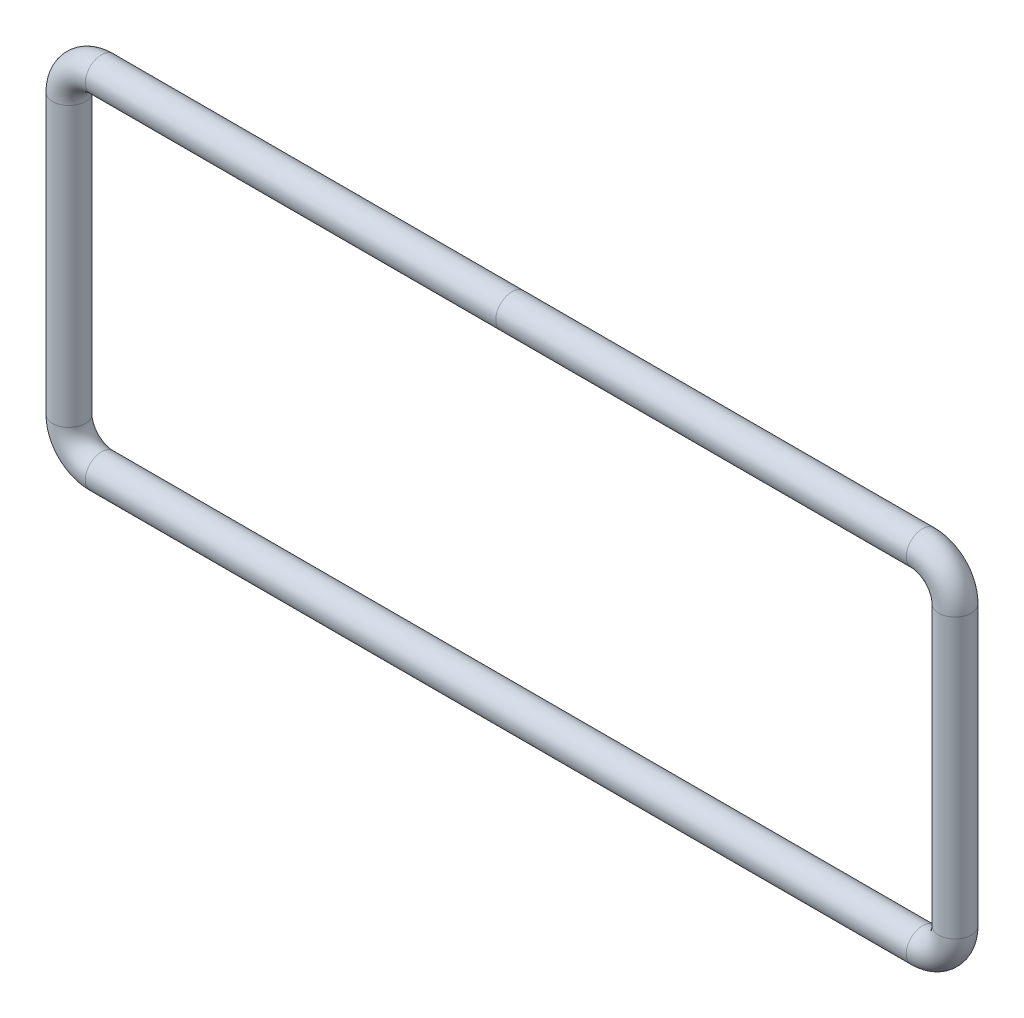
ISO-10303-21;
HEADER;
FILE_DESCRIPTION(('STEP AP214'),'2;1');
FILE_NAME('part.step','',(''),(''),'','','');
FILE_SCHEMA(('AUTOMOTIVE_DESIGN { 1 0 10303 214 1 1 1 1 }'));
ENDSEC;
DATA;
#1=APPLICATION_CONTEXT('core data for automotive mechanical design processes');
#2=APPLICATION_PROTOCOL_DEFINITION('international standard','automotive_design',2000,#1);
#3=PRODUCT_CONTEXT('',#1,'mechanical');
#4=PRODUCT('Part','Part','',(#3));
#5=PRODUCT_RELATED_PRODUCT_CATEGORY('part','',(#4));
#6=PRODUCT_DEFINITION_FORMATION('','',#4);
#7=PRODUCT_DEFINITION_CONTEXT('part definition',#1,'design');
#8=PRODUCT_DEFINITION('design','',#6,#7);
#9=PRODUCT_DEFINITION_SHAPE('','',#8);
#10=(LENGTH_UNIT() NAMED_UNIT(*) SI_UNIT(.MILLI.,.METRE.));
#11=(NAMED_UNIT(*) PLANE_ANGLE_UNIT() SI_UNIT($,.RADIAN.));
#12=(NAMED_UNIT(*) SI_UNIT($,.STERADIAN.) SOLID_ANGLE_UNIT());
#13=UNCERTAINTY_MEASURE_WITH_UNIT(LENGTH_MEASURE(1.E-05),#10,'distance_accuracy_value','');
#14=(GEOMETRIC_REPRESENTATION_CONTEXT(3) GLOBAL_UNCERTAINTY_ASSIGNED_CONTEXT((#13)) GLOBAL_UNIT_ASSIGNED_CONTEXT((#10,
#11,#12)) REPRESENTATION_CONTEXT('',''));
#15=CARTESIAN_POINT('',(0.,0.,0.));
#16=DIRECTION('',(0.,0.,1.));
#17=DIRECTION('',(1.,0.,0.));
#18=AXIS2_PLACEMENT_3D('',#15,#16,#17);
#19=CARTESIAN_POINT('',(-53.,22.2,0.));
#20=DIRECTION('',(1.,0.,0.));
#21=DIRECTION('',(0.,0.,-1.));
#22=AXIS2_PLACEMENT_3D('',#19,#20,#21);
#23=CYLINDRICAL_SURFACE('',#22,2.1);
#24=CARTESIAN_POINT('',(0.,22.2,0.));
#25=DIRECTION('',(1.,0.,0.));
#26=DIRECTION('',(0.,0.,-1.));
#27=AXIS2_PLACEMENT_3D('',#24,#25,#26);
#28=CIRCLE('',#27,2.1);
#29=CARTESIAN_POINT('',(0.,22.2,-2.1));
#30=VERTEX_POINT('',#29);
#31=EDGE_CURVE('E62',#30,#30,#28,.T.);
#32=ORIENTED_EDGE('',*,*,#31,.F.);
#33=EDGE_LOOP('',(#32));
#34=FACE_BOUND('',#33,.T.);
#35=CARTESIAN_POINT('',(-53.,22.2,0.));
#36=DIRECTION('',(1.,0.,0.));
#37=DIRECTION('',(0.,0.,-1.));
#38=AXIS2_PLACEMENT_3D('',#35,#36,#37);
#39=CIRCLE('',#38,2.1);
#40=CARTESIAN_POINT('',(-53.,24.3,0.));
#41=VERTEX_POINT('',#40);
#42=EDGE_CURVE('E10',#41,#41,#39,.T.);
#43=ORIENTED_EDGE('',*,*,#42,.T.);
#44=EDGE_LOOP('',(#43));
#45=FACE_BOUND('',#44,.T.);
#46=ADVANCED_FACE('F31',(#34,#45),#23,.T.);
#47=CARTESIAN_POINT('',(-53.,18.,0.));
#48=DIRECTION('',(0.,0.,-1.));
#49=DIRECTION('',(-1.,0.,0.));
#50=AXIS2_PLACEMENT_3D('',#47,#48,#49);
#51=TOROIDAL_SURFACE('',#50,4.2,2.1);
#52=CARTESIAN_POINT('',(-57.2,18.,0.));
#53=DIRECTION('',(0.,1.,0.));
#54=DIRECTION('',(0.,0.,-1.));
#55=AXIS2_PLACEMENT_3D('',#52,#53,#54);
#56=CIRCLE('',#55,2.1);
#57=CARTESIAN_POINT('',(-59.3,18.,0.));
#58=VERTEX_POINT('',#57);
#59=EDGE_CURVE('E37',#58,#58,#56,.T.);
#60=CARTESIAN_POINT('',(-53.,18.,0.));
#61=DIRECTION('',(0.,0.,-1.));
#62=DIRECTION('',(-1.,0.,0.));
#63=AXIS2_PLACEMENT_3D('',#60,#61,#62);
#64=CIRCLE('',#63,6.3);
#65=EDGE_CURVE('',#58,#41,#64,.T.);
#66=ORIENTED_EDGE('',*,*,#59,.T.);
#67=ORIENTED_EDGE('',*,*,#42,.F.);
#68=ORIENTED_EDGE('',*,*,#65,.T.);
#69=ORIENTED_EDGE('',*,*,#65,.F.);
#70=EDGE_LOOP('',(#66,#68,#67,#69));
#71=FACE_BOUND('',#70,.T.);
#72=ADVANCED_FACE('F69',(#71),#51,.T.);
#73=CARTESIAN_POINT('',(-57.2,-18.,0.));
#74=DIRECTION('',(0.,1.,0.));
#75=DIRECTION('',(-1.,0.,0.));
#76=AXIS2_PLACEMENT_3D('',#73,#74,#75);
#77=CYLINDRICAL_SURFACE('',#76,2.1);
#78=ORIENTED_EDGE('',*,*,#59,.F.);
#79=EDGE_LOOP('',(#78));
#80=FACE_BOUND('',#79,.T.);
#81=CARTESIAN_POINT('',(-57.2,-18.,0.));
#82=DIRECTION('',(0.,1.,0.));
#83=DIRECTION('',(0.,0.,-1.));
#84=AXIS2_PLACEMENT_3D('',#81,#82,#83);
#85=CIRCLE('',#84,2.1);
#86=CARTESIAN_POINT('',(-59.3,-18.,0.));
#87=VERTEX_POINT('',#86);
#88=EDGE_CURVE('E41',#87,#87,#85,.T.);
#89=ORIENTED_EDGE('',*,*,#88,.T.);
#90=EDGE_LOOP('',(#89));
#91=FACE_BOUND('',#90,.T.);
#92=ADVANCED_FACE('F73',(#80,#91),#77,.T.);
#93=CARTESIAN_POINT('',(-53.,-18.,0.));
#94=DIRECTION('',(0.,0.,-1.));
#95=DIRECTION('',(-1.,0.,0.));
#96=AXIS2_PLACEMENT_3D('',#93,#94,#95);
#97=TOROIDAL_SURFACE('',#96,4.2,2.1);
#98=CARTESIAN_POINT('',(-53.,-22.2,0.));
#99=DIRECTION('',(-1.,0.,0.));
#100=DIRECTION('',(0.,0.,-1.));
#101=AXIS2_PLACEMENT_3D('',#98,#99,#100);
#102=CIRCLE('',#101,2.1);
#103=CARTESIAN_POINT('',(-53.,-24.3,0.));
#104=VERTEX_POINT('',#103);
#105=EDGE_CURVE('E45',#104,#104,#102,.T.);
#106=CARTESIAN_POINT('',(-53.,-18.,0.));
#107=DIRECTION('',(0.,0.,-1.));
#108=DIRECTION('',(-1.,0.,0.));
#109=AXIS2_PLACEMENT_3D('',#106,#107,#108);
#110=CIRCLE('',#109,6.3);
#111=EDGE_CURVE('',#104,#87,#110,.T.);
#112=ORIENTED_EDGE('',*,*,#105,.T.);
#113=ORIENTED_EDGE('',*,*,#88,.F.);
#114=ORIENTED_EDGE('',*,*,#111,.T.);
#115=ORIENTED_EDGE('',*,*,#111,.F.);
#116=EDGE_LOOP('',(#112,#114,#113,#115));
#117=FACE_BOUND('',#116,.T.);
#118=ADVANCED_FACE('F78',(#117),#97,.T.);
#119=CARTESIAN_POINT('',(53.,-22.2,0.));
#120=DIRECTION('',(-1.,0.,0.));
#121=DIRECTION('',(0.,0.,1.));
#122=AXIS2_PLACEMENT_3D('',#119,#120,#121);
#123=CYLINDRICAL_SURFACE('',#122,2.1);
#124=ORIENTED_EDGE('',*,*,#105,.F.);
#125=EDGE_LOOP('',(#124));
#126=FACE_BOUND('',#125,.T.);
#127=CARTESIAN_POINT('',(53.,-22.2,0.));
#128=DIRECTION('',(-1.,0.,0.));
#129=DIRECTION('',(0.,0.,-1.));
#130=AXIS2_PLACEMENT_3D('',#127,#128,#129);
#131=CIRCLE('',#130,2.1);
#132=CARTESIAN_POINT('',(53.,-24.3,0.));
#133=VERTEX_POINT('',#132);
#134=EDGE_CURVE('E50',#133,#133,#131,.T.);
#135=ORIENTED_EDGE('',*,*,#134,.T.);
#136=EDGE_LOOP('',(#135));
#137=FACE_BOUND('',#136,.T.);
#138=ADVANCED_FACE('F84',(#126,#137),#123,.T.);
#139=CARTESIAN_POINT('',(53.,-18.,0.));
#140=DIRECTION('',(0.,0.,-1.));
#141=DIRECTION('',(-1.,0.,0.));
#142=AXIS2_PLACEMENT_3D('',#139,#140,#141);
#143=TOROIDAL_SURFACE('',#142,4.2,2.1);
#144=CARTESIAN_POINT('',(57.2,-18.,0.));
#145=DIRECTION('',(0.,-1.,0.));
#146=DIRECTION('',(0.,0.,-1.));
#147=AXIS2_PLACEMENT_3D('',#144,#145,#146);
#148=CIRCLE('',#147,2.1);
#149=CARTESIAN_POINT('',(59.3,-18.,0.));
#150=VERTEX_POINT('',#149);
#151=EDGE_CURVE('E53',#150,#150,#148,.T.);
#152=CARTESIAN_POINT('',(53.,-18.,0.));
#153=DIRECTION('',(0.,0.,-1.));
#154=DIRECTION('',(-1.,0.,0.));
#155=AXIS2_PLACEMENT_3D('',#152,#153,#154);
#156=CIRCLE('',#155,6.3);
#157=EDGE_CURVE('',#150,#133,#156,.T.);
#158=ORIENTED_EDGE('',*,*,#151,.T.);
#159=ORIENTED_EDGE('',*,*,#134,.F.);
#160=ORIENTED_EDGE('',*,*,#157,.T.);
#161=ORIENTED_EDGE('',*,*,#157,.F.);
#162=EDGE_LOOP('',(#158,#160,#159,#161));
#163=FACE_BOUND('',#162,.T.);
#164=ADVANCED_FACE('F88',(#163),#143,.T.);
#165=CARTESIAN_POINT('',(57.2,18.,0.));
#166=DIRECTION('',(0.,-1.,0.));
#167=DIRECTION('',(0.,0.,-1.));
#168=AXIS2_PLACEMENT_3D('',#165,#166,#167);
#169=CYLINDRICAL_SURFACE('',#168,2.1);
#170=ORIENTED_EDGE('',*,*,#151,.F.);
#171=EDGE_LOOP('',(#170));
#172=FACE_BOUND('',#171,.T.);
#173=CARTESIAN_POINT('',(57.2,18.,0.));
#174=DIRECTION('',(0.,-1.,0.));
#175=DIRECTION('',(0.,0.,-1.));
#176=AXIS2_PLACEMENT_3D('',#173,#174,#175);
#177=CIRCLE('',#176,2.1);
#178=CARTESIAN_POINT('',(59.3,18.,0.));
#179=VERTEX_POINT('',#178);
#180=EDGE_CURVE('E56',#179,#179,#177,.T.);
#181=ORIENTED_EDGE('',*,*,#180,.T.);
#182=EDGE_LOOP('',(#181));
#183=FACE_BOUND('',#182,.T.);
#184=ADVANCED_FACE('F92',(#172,#183),#169,.T.);
#185=CARTESIAN_POINT('',(53.,18.,0.));
#186=DIRECTION('',(0.,0.,-1.));
#187=DIRECTION('',(-1.,0.,0.));
#188=AXIS2_PLACEMENT_3D('',#185,#186,#187);
#189=TOROIDAL_SURFACE('',#188,4.2,2.1);
#190=CARTESIAN_POINT('',(53.,22.2,0.));
#191=DIRECTION('',(1.,0.,0.));
#192=DIRECTION('',(0.,0.,-1.));
#193=AXIS2_PLACEMENT_3D('',#190,#191,#192);
#194=CIRCLE('',#193,2.1);
#195=CARTESIAN_POINT('',(53.,24.3,0.));
#196=VERTEX_POINT('',#195);
#197=EDGE_CURVE('E59',#196,#196,#194,.T.);
#198=CARTESIAN_POINT('',(53.,18.,0.));
#199=DIRECTION('',(0.,0.,-1.));
#200=DIRECTION('',(-1.,0.,0.));
#201=AXIS2_PLACEMENT_3D('',#198,#199,#200);
#202=CIRCLE('',#201,6.3);
#203=EDGE_CURVE('',#196,#179,#202,.T.);
#204=ORIENTED_EDGE('',*,*,#197,.T.);
#205=ORIENTED_EDGE('',*,*,#180,.F.);
#206=ORIENTED_EDGE('',*,*,#203,.T.);
#207=ORIENTED_EDGE('',*,*,#203,.F.);
#208=EDGE_LOOP('',(#204,#206,#205,#207));
#209=FACE_BOUND('',#208,.T.);
#210=ADVANCED_FACE('F96',(#209),#189,.T.);
#211=CARTESIAN_POINT('',(0.,22.2,0.));
#212=DIRECTION('',(1.,0.,0.));
#213=DIRECTION('',(0.,0.,-1.));
#214=AXIS2_PLACEMENT_3D('',#211,#212,#213);
#215=CYLINDRICAL_SURFACE('',#214,2.1);
#216=ORIENTED_EDGE('',*,*,#197,.F.);
#217=EDGE_LOOP('',(#216));
#218=FACE_BOUND('',#217,.T.);
#219=ORIENTED_EDGE('',*,*,#31,.T.);
#220=EDGE_LOOP('',(#219));
#221=FACE_BOUND('',#220,.T.);
#222=ADVANCED_FACE('F66',(#218,#221),#215,.T.);
#223=CLOSED_SHELL('',(#46,#72,#92,#118,#138,#164,#184,#210,#222));
#224=MANIFOLD_SOLID_BREP('B2',#223);
#225=ADVANCED_BREP_SHAPE_REPRESENTATION('',(#18,#224),#14);
#226=SHAPE_DEFINITION_REPRESENTATION(#9,#225);
ENDSEC;
END-ISO-10303-21;
